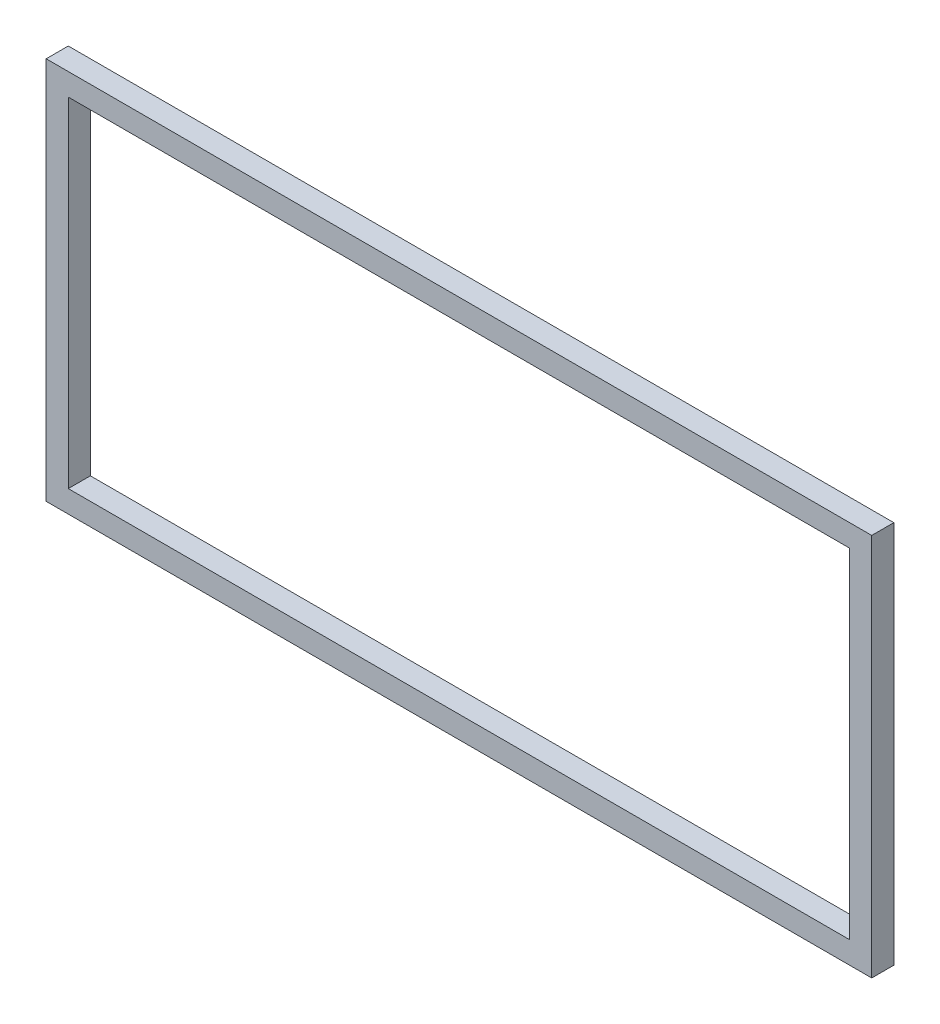
ISO-10303-21;
HEADER;
FILE_DESCRIPTION(('STEP AP214'),'2;1');
FILE_NAME('part.step','',(''),(''),'','','');
FILE_SCHEMA(('AUTOMOTIVE_DESIGN { 1 0 10303 214 1 1 1 1 }'));
ENDSEC;
DATA;
#1=APPLICATION_CONTEXT('core data for automotive mechanical design processes');
#2=APPLICATION_PROTOCOL_DEFINITION('international standard','automotive_design',2000,#1);
#3=PRODUCT_CONTEXT('',#1,'mechanical');
#4=PRODUCT('Part','Part','',(#3));
#5=PRODUCT_RELATED_PRODUCT_CATEGORY('part','',(#4));
#6=PRODUCT_DEFINITION_FORMATION('','',#4);
#7=PRODUCT_DEFINITION_CONTEXT('part definition',#1,'design');
#8=PRODUCT_DEFINITION('design','',#6,#7);
#9=PRODUCT_DEFINITION_SHAPE('','',#8);
#10=(LENGTH_UNIT() NAMED_UNIT(*) SI_UNIT(.MILLI.,.METRE.));
#11=(NAMED_UNIT(*) PLANE_ANGLE_UNIT() SI_UNIT($,.RADIAN.));
#12=(NAMED_UNIT(*) SI_UNIT($,.STERADIAN.) SOLID_ANGLE_UNIT());
#13=UNCERTAINTY_MEASURE_WITH_UNIT(LENGTH_MEASURE(1.E-05),#10,'distance_accuracy_value','');
#14=(GEOMETRIC_REPRESENTATION_CONTEXT(3) GLOBAL_UNCERTAINTY_ASSIGNED_CONTEXT((#13)) GLOBAL_UNIT_ASSIGNED_CONTEXT((#10,
#11,#12)) REPRESENTATION_CONTEXT('',''));
#15=CARTESIAN_POINT('',(0.,0.,0.));
#16=DIRECTION('',(0.,0.,1.));
#17=DIRECTION('',(1.,0.,0.));
#18=AXIS2_PLACEMENT_3D('',#15,#16,#17);
#19=CARTESIAN_POINT('',(0.,0.,30.));
#20=DIRECTION('',(0.,0.,-1.));
#21=DIRECTION('',(-1.,0.,0.));
#22=AXIS2_PLACEMENT_3D('',#19,#20,#21);
#23=PLANE('',#22);
#24=DIRECTION('',(0.,1.,0.));
#25=VECTOR('',#24,1.);
#26=CARTESIAN_POINT('',(560.,-260.,30.));
#27=LINE('',#26,#25);
#28=CARTESIAN_POINT('',(560.,-260.,30.));
#29=VERTEX_POINT('',#28);
#30=CARTESIAN_POINT('',(560.,260.,30.));
#31=VERTEX_POINT('',#30);
#32=EDGE_CURVE('E138',#29,#31,#27,.T.);
#33=ORIENTED_EDGE('',*,*,#32,.T.);
#34=DIRECTION('',(-1.,0.,0.));
#35=VECTOR('',#34,1.);
#36=CARTESIAN_POINT('',(-560.,260.,30.));
#37=LINE('',#36,#35);
#38=CARTESIAN_POINT('',(-560.,260.,30.));
#39=VERTEX_POINT('',#38);
#40=EDGE_CURVE('E141',#31,#39,#37,.T.);
#41=ORIENTED_EDGE('',*,*,#40,.T.);
#42=DIRECTION('',(0.,-1.,0.));
#43=VECTOR('',#42,1.);
#44=CARTESIAN_POINT('',(-560.,-260.,30.));
#45=LINE('',#44,#43);
#46=CARTESIAN_POINT('',(-560.,-260.,30.));
#47=VERTEX_POINT('',#46);
#48=EDGE_CURVE('E148',#39,#47,#45,.T.);
#49=ORIENTED_EDGE('',*,*,#48,.T.);
#50=DIRECTION('',(1.,0.,0.));
#51=VECTOR('',#50,1.);
#52=CARTESIAN_POINT('',(-560.,-260.,30.));
#53=LINE('',#52,#51);
#54=EDGE_CURVE('E146',#47,#29,#53,.T.);
#55=ORIENTED_EDGE('',*,*,#54,.T.);
#56=EDGE_LOOP('',(#33,#41,#49,#55));
#57=FACE_BOUND('',#56,.T.);
#58=DIRECTION('',(0.,1.,0.));
#59=VECTOR('',#58,1.);
#60=CARTESIAN_POINT('',(530.,-230.,30.));
#61=LINE('',#60,#59);
#62=CARTESIAN_POINT('',(530.,-230.,30.));
#63=VERTEX_POINT('',#62);
#64=CARTESIAN_POINT('',(530.,230.,30.));
#65=VERTEX_POINT('',#64);
#66=EDGE_CURVE('E102',#63,#65,#61,.T.);
#67=ORIENTED_EDGE('',*,*,#66,.F.);
#68=DIRECTION('',(1.,0.,0.));
#69=VECTOR('',#68,1.);
#70=CARTESIAN_POINT('',(-530.,-230.,30.));
#71=LINE('',#70,#69);
#72=CARTESIAN_POINT('',(-530.,-230.,30.));
#73=VERTEX_POINT('',#72);
#74=EDGE_CURVE('E127',#73,#63,#71,.T.);
#75=ORIENTED_EDGE('',*,*,#74,.F.);
#76=DIRECTION('',(0.,-1.,0.));
#77=VECTOR('',#76,1.);
#78=CARTESIAN_POINT('',(-530.,-230.,30.));
#79=LINE('',#78,#77);
#80=CARTESIAN_POINT('',(-530.,230.,30.));
#81=VERTEX_POINT('',#80);
#82=EDGE_CURVE('E121',#81,#73,#79,.T.);
#83=ORIENTED_EDGE('',*,*,#82,.F.);
#84=DIRECTION('',(-1.,0.,0.));
#85=VECTOR('',#84,1.);
#86=CARTESIAN_POINT('',(-530.,230.,30.));
#87=LINE('',#86,#85);
#88=EDGE_CURVE('E115',#65,#81,#87,.T.);
#89=ORIENTED_EDGE('',*,*,#88,.F.);
#90=EDGE_LOOP('',(#67,#75,#83,#89));
#91=FACE_BOUND('',#90,.T.);
#92=ADVANCED_FACE('F39',(#57,#91),#23,.F.);
#93=CARTESIAN_POINT('',(0.,0.,0.));
#94=DIRECTION('',(0.,0.,-1.));
#95=DIRECTION('',(-1.,0.,0.));
#96=AXIS2_PLACEMENT_3D('',#93,#94,#95);
#97=PLANE('',#96);
#98=DIRECTION('',(0.,1.,0.));
#99=VECTOR('',#98,1.);
#100=CARTESIAN_POINT('',(560.,-260.,0.));
#101=LINE('',#100,#99);
#102=CARTESIAN_POINT('',(560.,-260.,0.));
#103=VERTEX_POINT('',#102);
#104=CARTESIAN_POINT('',(560.,260.,0.));
#105=VERTEX_POINT('',#104);
#106=EDGE_CURVE('E119',#103,#105,#101,.T.);
#107=ORIENTED_EDGE('',*,*,#106,.F.);
#108=DIRECTION('',(1.,0.,0.));
#109=VECTOR('',#108,1.);
#110=CARTESIAN_POINT('',(-560.,-260.,0.));
#111=LINE('',#110,#109);
#112=CARTESIAN_POINT('',(-560.,-260.,0.));
#113=VERTEX_POINT('',#112);
#114=EDGE_CURVE('E145',#113,#103,#111,.T.);
#115=ORIENTED_EDGE('',*,*,#114,.F.);
#116=DIRECTION('',(0.,-1.,0.));
#117=VECTOR('',#116,1.);
#118=CARTESIAN_POINT('',(-560.,-260.,0.));
#119=LINE('',#118,#117);
#120=CARTESIAN_POINT('',(-560.,260.,0.));
#121=VERTEX_POINT('',#120);
#122=EDGE_CURVE('E154',#121,#113,#119,.T.);
#123=ORIENTED_EDGE('',*,*,#122,.F.);
#124=DIRECTION('',(-1.,0.,0.));
#125=VECTOR('',#124,1.);
#126=CARTESIAN_POINT('',(-560.,260.,0.));
#127=LINE('',#126,#125);
#128=EDGE_CURVE('E153',#105,#121,#127,.T.);
#129=ORIENTED_EDGE('',*,*,#128,.F.);
#130=EDGE_LOOP('',(#107,#115,#123,#129));
#131=FACE_BOUND('',#130,.T.);
#132=DIRECTION('',(1.,0.,0.));
#133=VECTOR('',#132,1.);
#134=CARTESIAN_POINT('',(-530.,-230.,0.));
#135=LINE('',#134,#133);
#136=CARTESIAN_POINT('',(-530.,-230.,0.));
#137=VERTEX_POINT('',#136);
#138=CARTESIAN_POINT('',(530.,-230.,0.));
#139=VERTEX_POINT('',#138);
#140=EDGE_CURVE('E114',#137,#139,#135,.T.);
#141=ORIENTED_EDGE('',*,*,#140,.T.);
#142=DIRECTION('',(0.,1.,0.));
#143=VECTOR('',#142,1.);
#144=CARTESIAN_POINT('',(530.,-230.,0.));
#145=LINE('',#144,#143);
#146=CARTESIAN_POINT('',(530.,230.,0.));
#147=VERTEX_POINT('',#146);
#148=EDGE_CURVE('E65',#139,#147,#145,.T.);
#149=ORIENTED_EDGE('',*,*,#148,.T.);
#150=DIRECTION('',(-1.,0.,0.));
#151=VECTOR('',#150,1.);
#152=CARTESIAN_POINT('',(-530.,230.,0.));
#153=LINE('',#152,#151);
#154=CARTESIAN_POINT('',(-530.,230.,0.));
#155=VERTEX_POINT('',#154);
#156=EDGE_CURVE('E118',#147,#155,#153,.T.);
#157=ORIENTED_EDGE('',*,*,#156,.T.);
#158=DIRECTION('',(0.,-1.,0.));
#159=VECTOR('',#158,1.);
#160=CARTESIAN_POINT('',(-530.,-230.,0.));
#161=LINE('',#160,#159);
#162=EDGE_CURVE('E135',#155,#137,#161,.T.);
#163=ORIENTED_EDGE('',*,*,#162,.T.);
#164=EDGE_LOOP('',(#141,#149,#157,#163));
#165=FACE_BOUND('',#164,.T.);
#166=ADVANCED_FACE('F172',(#131,#165),#97,.T.);
#167=CARTESIAN_POINT('',(560.,-260.,30.));
#168=DIRECTION('',(-1.,0.,0.));
#169=DIRECTION('',(0.,0.,1.));
#170=AXIS2_PLACEMENT_3D('',#167,#168,#169);
#171=PLANE('',#170);
#172=ORIENTED_EDGE('',*,*,#106,.T.);
#173=DIRECTION('',(0.,0.,-1.));
#174=VECTOR('',#173,1.);
#175=CARTESIAN_POINT('',(560.,260.,30.));
#176=LINE('',#175,#174);
#177=EDGE_CURVE('E11',#31,#105,#176,.T.);
#178=ORIENTED_EDGE('',*,*,#177,.F.);
#179=ORIENTED_EDGE('',*,*,#32,.F.);
#180=DIRECTION('',(0.,0.,-1.));
#181=VECTOR('',#180,1.);
#182=CARTESIAN_POINT('',(560.,-260.,30.));
#183=LINE('',#182,#181);
#184=EDGE_CURVE('E147',#29,#103,#183,.T.);
#185=ORIENTED_EDGE('',*,*,#184,.T.);
#186=EDGE_LOOP('',(#172,#178,#179,#185));
#187=FACE_BOUND('',#186,.T.);
#188=ADVANCED_FACE('F41',(#187),#171,.F.);
#189=CARTESIAN_POINT('',(-560.,260.,30.));
#190=DIRECTION('',(0.,-1.,0.));
#191=DIRECTION('',(0.,0.,-1.));
#192=AXIS2_PLACEMENT_3D('',#189,#190,#191);
#193=PLANE('',#192);
#194=ORIENTED_EDGE('',*,*,#128,.T.);
#195=DIRECTION('',(0.,0.,-1.));
#196=VECTOR('',#195,1.);
#197=CARTESIAN_POINT('',(-560.,260.,30.));
#198=LINE('',#197,#196);
#199=EDGE_CURVE('E50',#39,#121,#198,.T.);
#200=ORIENTED_EDGE('',*,*,#199,.F.);
#201=ORIENTED_EDGE('',*,*,#40,.F.);
#202=ORIENTED_EDGE('',*,*,#177,.T.);
#203=EDGE_LOOP('',(#194,#200,#201,#202));
#204=FACE_BOUND('',#203,.T.);
#205=ADVANCED_FACE('F181',(#204),#193,.F.);
#206=CARTESIAN_POINT('',(-560.,-260.,30.));
#207=DIRECTION('',(1.,0.,0.));
#208=DIRECTION('',(0.,0.,-1.));
#209=AXIS2_PLACEMENT_3D('',#206,#207,#208);
#210=PLANE('',#209);
#211=ORIENTED_EDGE('',*,*,#122,.T.);
#212=DIRECTION('',(0.,0.,-1.));
#213=VECTOR('',#212,1.);
#214=CARTESIAN_POINT('',(-560.,-260.,30.));
#215=LINE('',#214,#213);
#216=EDGE_CURVE('E159',#47,#113,#215,.T.);
#217=ORIENTED_EDGE('',*,*,#216,.F.);
#218=ORIENTED_EDGE('',*,*,#48,.F.);
#219=ORIENTED_EDGE('',*,*,#199,.T.);
#220=EDGE_LOOP('',(#211,#217,#218,#219));
#221=FACE_BOUND('',#220,.T.);
#222=ADVANCED_FACE('F170',(#221),#210,.F.);
#223=CARTESIAN_POINT('',(-560.,-260.,30.));
#224=DIRECTION('',(0.,1.,0.));
#225=DIRECTION('',(0.,0.,1.));
#226=AXIS2_PLACEMENT_3D('',#223,#224,#225);
#227=PLANE('',#226);
#228=ORIENTED_EDGE('',*,*,#114,.T.);
#229=ORIENTED_EDGE('',*,*,#184,.F.);
#230=ORIENTED_EDGE('',*,*,#54,.F.);
#231=ORIENTED_EDGE('',*,*,#216,.T.);
#232=EDGE_LOOP('',(#228,#229,#230,#231));
#233=FACE_BOUND('',#232,.T.);
#234=ADVANCED_FACE('F179',(#233),#227,.F.);
#235=CARTESIAN_POINT('',(530.,-230.,30.));
#236=DIRECTION('',(-1.,0.,0.));
#237=DIRECTION('',(0.,0.,1.));
#238=AXIS2_PLACEMENT_3D('',#235,#236,#237);
#239=PLANE('',#238);
#240=ORIENTED_EDGE('',*,*,#148,.F.);
#241=DIRECTION('',(0.,0.,-1.));
#242=VECTOR('',#241,1.);
#243=CARTESIAN_POINT('',(530.,-230.,30.));
#244=LINE('',#243,#242);
#245=EDGE_CURVE('E107',#63,#139,#244,.T.);
#246=ORIENTED_EDGE('',*,*,#245,.F.);
#247=ORIENTED_EDGE('',*,*,#66,.T.);
#248=DIRECTION('',(0.,0.,-1.));
#249=VECTOR('',#248,1.);
#250=CARTESIAN_POINT('',(530.,230.,30.));
#251=LINE('',#250,#249);
#252=EDGE_CURVE('E110',#65,#147,#251,.T.);
#253=ORIENTED_EDGE('',*,*,#252,.T.);
#254=EDGE_LOOP('',(#240,#246,#247,#253));
#255=FACE_BOUND('',#254,.T.);
#256=ADVANCED_FACE('F106',(#255),#239,.T.);
#257=CARTESIAN_POINT('',(-530.,230.,30.));
#258=DIRECTION('',(0.,-1.,0.));
#259=DIRECTION('',(0.,0.,-1.));
#260=AXIS2_PLACEMENT_3D('',#257,#258,#259);
#261=PLANE('',#260);
#262=ORIENTED_EDGE('',*,*,#156,.F.);
#263=ORIENTED_EDGE('',*,*,#252,.F.);
#264=ORIENTED_EDGE('',*,*,#88,.T.);
#265=DIRECTION('',(0.,0.,-1.));
#266=VECTOR('',#265,1.);
#267=CARTESIAN_POINT('',(-530.,230.,30.));
#268=LINE('',#267,#266);
#269=EDGE_CURVE('E122',#81,#155,#268,.T.);
#270=ORIENTED_EDGE('',*,*,#269,.T.);
#271=EDGE_LOOP('',(#262,#263,#264,#270));
#272=FACE_BOUND('',#271,.T.);
#273=ADVANCED_FACE('F116',(#272),#261,.T.);
#274=CARTESIAN_POINT('',(-530.,-230.,30.));
#275=DIRECTION('',(1.,0.,0.));
#276=DIRECTION('',(0.,0.,-1.));
#277=AXIS2_PLACEMENT_3D('',#274,#275,#276);
#278=PLANE('',#277);
#279=ORIENTED_EDGE('',*,*,#162,.F.);
#280=ORIENTED_EDGE('',*,*,#269,.F.);
#281=ORIENTED_EDGE('',*,*,#82,.T.);
#282=DIRECTION('',(0.,0.,-1.));
#283=VECTOR('',#282,1.);
#284=CARTESIAN_POINT('',(-530.,-230.,30.));
#285=LINE('',#284,#283);
#286=EDGE_CURVE('E53',#73,#137,#285,.T.);
#287=ORIENTED_EDGE('',*,*,#286,.T.);
#288=EDGE_LOOP('',(#279,#280,#281,#287));
#289=FACE_BOUND('',#288,.T.);
#290=ADVANCED_FACE('F206',(#289),#278,.T.);
#291=CARTESIAN_POINT('',(-530.,-230.,30.));
#292=DIRECTION('',(0.,1.,0.));
#293=DIRECTION('',(0.,0.,1.));
#294=AXIS2_PLACEMENT_3D('',#291,#292,#293);
#295=PLANE('',#294);
#296=ORIENTED_EDGE('',*,*,#140,.F.);
#297=ORIENTED_EDGE('',*,*,#286,.F.);
#298=ORIENTED_EDGE('',*,*,#74,.T.);
#299=ORIENTED_EDGE('',*,*,#245,.T.);
#300=EDGE_LOOP('',(#296,#297,#298,#299));
#301=FACE_BOUND('',#300,.T.);
#302=ADVANCED_FACE('F209',(#301),#295,.T.);
#303=CLOSED_SHELL('',(#92,#166,#188,#205,#222,#234,#256,#273,#290,#302));
#304=MANIFOLD_SOLID_BREP('B2',#303);
#305=ADVANCED_BREP_SHAPE_REPRESENTATION('',(#18,#304),#14);
#306=SHAPE_DEFINITION_REPRESENTATION(#9,#305);
ENDSEC;
END-ISO-10303-21;
